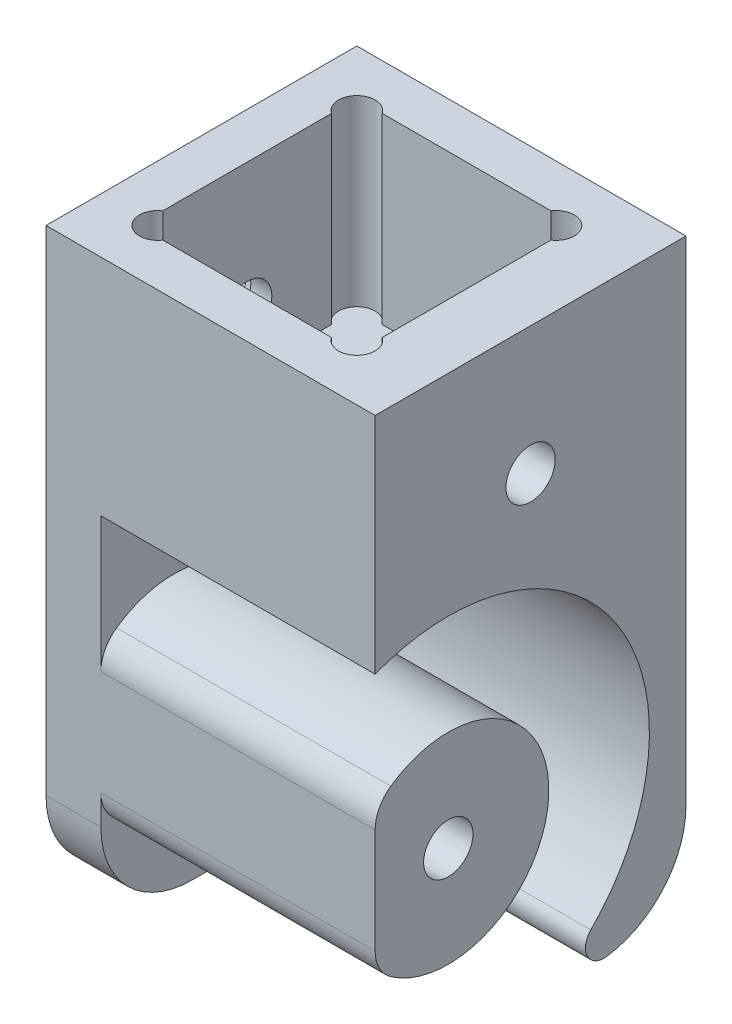
ISO-10303-21;
HEADER;
FILE_DESCRIPTION(('STEP AP214'),'2;1');
FILE_NAME('part.step','',(''),(''),'','','');
FILE_SCHEMA(('AUTOMOTIVE_DESIGN { 1 0 10303 214 1 1 1 1 }'));
ENDSEC;
DATA;
#1=APPLICATION_CONTEXT('core data for automotive mechanical design processes');
#2=APPLICATION_PROTOCOL_DEFINITION('international standard','automotive_design',2000,#1);
#3=PRODUCT_CONTEXT('',#1,'mechanical');
#4=PRODUCT('Part','Part','',(#3));
#5=PRODUCT_RELATED_PRODUCT_CATEGORY('part','',(#4));
#6=PRODUCT_DEFINITION_FORMATION('','',#4);
#7=PRODUCT_DEFINITION_CONTEXT('part definition',#1,'design');
#8=PRODUCT_DEFINITION('design','',#6,#7);
#9=PRODUCT_DEFINITION_SHAPE('','',#8);
#10=(LENGTH_UNIT() NAMED_UNIT(*) SI_UNIT(.MILLI.,.METRE.));
#11=(NAMED_UNIT(*) PLANE_ANGLE_UNIT() SI_UNIT($,.RADIAN.));
#12=(NAMED_UNIT(*) SI_UNIT($,.STERADIAN.) SOLID_ANGLE_UNIT());
#13=UNCERTAINTY_MEASURE_WITH_UNIT(LENGTH_MEASURE(1.E-05),#10,'distance_accuracy_value','');
#14=(GEOMETRIC_REPRESENTATION_CONTEXT(3) GLOBAL_UNCERTAINTY_ASSIGNED_CONTEXT((#13)) GLOBAL_UNIT_ASSIGNED_CONTEXT((#10,
#11,#12)) REPRESENTATION_CONTEXT('',''));
#15=CARTESIAN_POINT('',(0.,0.,0.));
#16=DIRECTION('',(0.,0.,1.));
#17=DIRECTION('',(1.,0.,0.));
#18=AXIS2_PLACEMENT_3D('',#15,#16,#17);
#19=CARTESIAN_POINT('',(-6.,10.,8.5));
#20=DIRECTION('',(1.,0.,0.));
#21=DIRECTION('',(0.,0.,-1.));
#22=AXIS2_PLACEMENT_3D('',#19,#20,#21);
#23=PLANE('',#22);
#24=DIRECTION('',(0.,-1.,0.));
#25=VECTOR('',#24,1.);
#26=CARTESIAN_POINT('',(-6.,10.,8.5));
#27=LINE('',#26,#25);
#28=CARTESIAN_POINT('',(-6.,-15.372281323269,8.5));
#29=VERTEX_POINT('',#28);
#30=CARTESIAN_POINT('',(-6.,-17.,8.5));
#31=VERTEX_POINT('',#30);
#32=EDGE_CURVE('E338',#29,#31,#27,.T.);
#33=ORIENTED_EDGE('',*,*,#32,.T.);
#34=CARTESIAN_POINT('',(-6.,-17.,3.5));
#35=DIRECTION('',(1.,0.,0.));
#36=DIRECTION('',(0.,0.,-1.));
#37=AXIS2_PLACEMENT_3D('',#34,#35,#36);
#38=CIRCLE('',#37,5.);
#39=CARTESIAN_POINT('',(-6.,-22.,3.5));
#40=VERTEX_POINT('',#39);
#41=EDGE_CURVE('E273',#31,#40,#38,.T.);
#42=ORIENTED_EDGE('',*,*,#41,.T.);
#43=DIRECTION('',(0.,0.,1.));
#44=VECTOR('',#43,1.);
#45=CARTESIAN_POINT('',(-6.,-22.,0.));
#46=LINE('',#45,#44);
#47=CARTESIAN_POINT('',(-6.,-22.,-3.5));
#48=VERTEX_POINT('',#47);
#49=EDGE_CURVE('E253',#48,#40,#46,.T.);
#50=ORIENTED_EDGE('',*,*,#49,.F.);
#51=CARTESIAN_POINT('',(-6.,-17.,-3.5));
#52=DIRECTION('',(1.,0.,0.));
#53=DIRECTION('',(0.,0.,-1.));
#54=AXIS2_PLACEMENT_3D('',#51,#52,#53);
#55=CIRCLE('',#54,5.);
#56=CARTESIAN_POINT('',(-6.,-21.960440112722,-4.1277211865939));
#57=VERTEX_POINT('',#56);
#58=EDGE_CURVE('E294',#57,#48,#55,.F.);
#59=ORIENTED_EDGE('',*,*,#58,.F.);
#60=CARTESIAN_POINT('',(-6.,-20.9683520901776,-4.00217694927512));
#61=DIRECTION('',(1.,0.,0.));
#62=DIRECTION('',(0.,0.,-1.));
#63=AXIS2_PLACEMENT_3D('',#60,#61,#62);
#64=CIRCLE('',#63,1.);
#65=CARTESIAN_POINT('',(-6.,-20.2626560826628,-3.29366220350219));
#66=VERTEX_POINT('',#65);
#67=EDGE_CURVE('E12',#57,#66,#64,.F.);
#68=ORIENTED_EDGE('',*,*,#67,.T.);
#69=CARTESIAN_POINT('',(-6.,-12.5,4.5));
#70=DIRECTION('',(1.,0.,0.));
#71=DIRECTION('',(0.,0.,-1.));
#72=AXIS2_PLACEMENT_3D('',#69,#70,#71);
#73=CIRCLE('',#72,11.);
#74=CARTESIAN_POINT('',(-6.,-2.2530492340404,8.5));
#75=VERTEX_POINT('',#74);
#76=EDGE_CURVE('E341',#66,#75,#73,.T.);
#77=ORIENTED_EDGE('',*,*,#76,.T.);
#78=CARTESIAN_POINT('',(-6.,-9.62771867673099,8.5));
#79=VERTEX_POINT('',#78);
#80=EDGE_CURVE('E337',#75,#79,#27,.T.);
#81=ORIENTED_EDGE('',*,*,#80,.T.);
#82=CARTESIAN_POINT('',(-6.,-9.62771867673099,6.5));
#83=DIRECTION('',(1.,0.,0.));
#84=DIRECTION('',(0.,0.,-1.));
#85=AXIS2_PLACEMENT_3D('',#82,#83,#84);
#86=CIRCLE('',#85,2.);
#87=CARTESIAN_POINT('',(-6.,-7.98641506343441,7.64285714285714));
#88=VERTEX_POINT('',#87);
#89=EDGE_CURVE('E289',#79,#88,#86,.F.);
#90=ORIENTED_EDGE('',*,*,#89,.T.);
#91=CARTESIAN_POINT('',(-6.,-12.5,4.5));
#92=DIRECTION('',(1.,0.,0.));
#93=DIRECTION('',(0.,0.,-1.));
#94=AXIS2_PLACEMENT_3D('',#91,#92,#93);
#95=CIRCLE('',#94,5.5);
#96=CARTESIAN_POINT('',(-6.,-17.0135849365656,7.64285714285714));
#97=VERTEX_POINT('',#96);
#98=EDGE_CURVE('E348',#97,#88,#95,.T.);
#99=ORIENTED_EDGE('',*,*,#98,.F.);
#100=CARTESIAN_POINT('',(-6.,-15.372281323269,6.5));
#101=DIRECTION('',(1.,0.,0.));
#102=DIRECTION('',(0.,0.,-1.));
#103=AXIS2_PLACEMENT_3D('',#100,#101,#102);
#104=CIRCLE('',#103,2.);
#105=EDGE_CURVE('E291',#97,#29,#104,.F.);
#106=ORIENTED_EDGE('',*,*,#105,.T.);
#107=EDGE_LOOP('',(#33,#42,#50,#59,#68,#77,#81,#90,#99,#106));
#108=FACE_BOUND('',#107,.T.);
#109=ADVANCED_FACE('F40',(#108),#23,.T.);
#110=CARTESIAN_POINT('',(-9.,10.,8.5));
#111=DIRECTION('',(0.,0.,-1.));
#112=DIRECTION('',(-1.,0.,0.));
#113=AXIS2_PLACEMENT_3D('',#110,#111,#112);
#114=PLANE('',#113);
#115=DIRECTION('',(0.,1.,0.));
#116=VECTOR('',#115,1.);
#117=CARTESIAN_POINT('',(9.,0.,8.5));
#118=LINE('',#117,#116);
#119=CARTESIAN_POINT('',(9.,-15.372281323269,8.5));
#120=VERTEX_POINT('',#119);
#121=CARTESIAN_POINT('',(9.,-9.62771867673099,8.5));
#122=VERTEX_POINT('',#121);
#123=EDGE_CURVE('E344',#120,#122,#118,.T.);
#124=ORIENTED_EDGE('',*,*,#123,.T.);
#125=DIRECTION('',(-1.,0.,0.));
#126=VECTOR('',#125,1.);
#127=CARTESIAN_POINT('',(-9.,-9.62771867673099,8.5));
#128=LINE('',#127,#126);
#129=EDGE_CURVE('E277',#122,#79,#128,.T.);
#130=ORIENTED_EDGE('',*,*,#129,.T.);
#131=ORIENTED_EDGE('',*,*,#80,.F.);
#132=DIRECTION('',(1.,0.,0.));
#133=VECTOR('',#132,1.);
#134=CARTESIAN_POINT('',(-40.1126983722081,-2.25304923404041,8.5));
#135=LINE('',#134,#133);
#136=CARTESIAN_POINT('',(9.,-2.2530492340404,8.5));
#137=VERTEX_POINT('',#136);
#138=EDGE_CURVE('E320',#137,#75,#135,.F.);
#139=ORIENTED_EDGE('',*,*,#138,.F.);
#140=DIRECTION('',(0.,-1.,0.));
#141=VECTOR('',#140,1.);
#142=CARTESIAN_POINT('',(9.,10.,8.5));
#143=LINE('',#142,#141);
#144=CARTESIAN_POINT('',(9.,10.,8.5));
#145=VERTEX_POINT('',#144);
#146=EDGE_CURVE('E241',#145,#137,#143,.T.);
#147=ORIENTED_EDGE('',*,*,#146,.F.);
#148=DIRECTION('',(1.,0.,0.));
#149=VECTOR('',#148,1.);
#150=CARTESIAN_POINT('',(-9.,10.,8.5));
#151=LINE('',#150,#149);
#152=CARTESIAN_POINT('',(-9.,10.,8.5));
#153=VERTEX_POINT('',#152);
#154=EDGE_CURVE('E239',#153,#145,#151,.T.);
#155=ORIENTED_EDGE('',*,*,#154,.F.);
#156=DIRECTION('',(0.,-1.,0.));
#157=VECTOR('',#156,1.);
#158=CARTESIAN_POINT('',(-9.,10.,8.5));
#159=LINE('',#158,#157);
#160=CARTESIAN_POINT('',(-9.,-17.,8.5));
#161=VERTEX_POINT('',#160);
#162=EDGE_CURVE('E244',#153,#161,#159,.T.);
#163=ORIENTED_EDGE('',*,*,#162,.T.);
#164=DIRECTION('',(-1.,0.,0.));
#165=VECTOR('',#164,1.);
#166=CARTESIAN_POINT('',(-6.,-17.,8.5));
#167=LINE('',#166,#165);
#168=EDGE_CURVE('E271',#161,#31,#167,.F.);
#169=ORIENTED_EDGE('',*,*,#168,.T.);
#170=ORIENTED_EDGE('',*,*,#32,.F.);
#171=DIRECTION('',(-1.,0.,0.));
#172=VECTOR('',#171,1.);
#173=CARTESIAN_POINT('',(-9.,-15.372281323269,8.5));
#174=LINE('',#173,#172);
#175=EDGE_CURVE('E275',#29,#120,#174,.F.);
#176=ORIENTED_EDGE('',*,*,#175,.T.);
#177=EDGE_LOOP('',(#124,#130,#131,#139,#147,#155,#163,#169,#170,#176));
#178=FACE_BOUND('',#177,.T.);
#179=ADVANCED_FACE('F334',(#178),#114,.F.);
#180=CARTESIAN_POINT('',(0.,-22.,0.));
#181=DIRECTION('',(0.,-1.,0.));
#182=DIRECTION('',(0.,0.,-1.));
#183=AXIS2_PLACEMENT_3D('',#180,#181,#182);
#184=PLANE('',#183);
#185=DIRECTION('',(1.,0.,0.));
#186=VECTOR('',#185,1.);
#187=CARTESIAN_POINT('',(9.,-22.,-3.5));
#188=LINE('',#187,#186);
#189=CARTESIAN_POINT('',(-9.,-22.,-3.5));
#190=VERTEX_POINT('',#189);
#191=EDGE_CURVE('E256',#190,#48,#188,.T.);
#192=ORIENTED_EDGE('',*,*,#191,.T.);
#193=ORIENTED_EDGE('',*,*,#49,.T.);
#194=DIRECTION('',(-1.,0.,0.));
#195=VECTOR('',#194,1.);
#196=CARTESIAN_POINT('',(-9.,-22.,3.5));
#197=LINE('',#196,#195);
#198=CARTESIAN_POINT('',(-9.,-22.,3.5));
#199=VERTEX_POINT('',#198);
#200=EDGE_CURVE('E266',#40,#199,#197,.T.);
#201=ORIENTED_EDGE('',*,*,#200,.T.);
#202=DIRECTION('',(0.,0.,-1.));
#203=VECTOR('',#202,1.);
#204=CARTESIAN_POINT('',(-9.,-22.,8.5));
#205=LINE('',#204,#203);
#206=EDGE_CURVE('E217',#199,#190,#205,.T.);
#207=ORIENTED_EDGE('',*,*,#206,.T.);
#208=EDGE_LOOP('',(#192,#193,#201,#207));
#209=FACE_BOUND('',#208,.T.);
#210=ADVANCED_FACE('F316',(#209),#184,.T.);
#211=CARTESIAN_POINT('',(0.,10.,0.));
#212=DIRECTION('',(0.,-1.,0.));
#213=DIRECTION('',(0.,0.,-1.));
#214=AXIS2_PLACEMENT_3D('',#211,#212,#213);
#215=PLANE('',#214);
#216=DIRECTION('',(0.,0.,-1.));
#217=VECTOR('',#216,1.);
#218=CARTESIAN_POINT('',(9.,10.,8.5));
#219=LINE('',#218,#217);
#220=CARTESIAN_POINT('',(9.,10.,-8.5));
#221=VERTEX_POINT('',#220);
#222=EDGE_CURVE('E225',#145,#221,#219,.T.);
#223=ORIENTED_EDGE('',*,*,#222,.T.);
#224=DIRECTION('',(-1.,0.,0.));
#225=VECTOR('',#224,1.);
#226=CARTESIAN_POINT('',(-9.,10.,-8.5));
#227=LINE('',#226,#225);
#228=CARTESIAN_POINT('',(-9.,10.,-8.5));
#229=VERTEX_POINT('',#228);
#230=EDGE_CURVE('E235',#221,#229,#227,.T.);
#231=ORIENTED_EDGE('',*,*,#230,.T.);
#232=DIRECTION('',(0.,0.,1.));
#233=VECTOR('',#232,1.);
#234=CARTESIAN_POINT('',(-9.,10.,8.5));
#235=LINE('',#234,#233);
#236=EDGE_CURVE('E237',#229,#153,#235,.T.);
#237=ORIENTED_EDGE('',*,*,#236,.T.);
#238=ORIENTED_EDGE('',*,*,#154,.T.);
#239=EDGE_LOOP('',(#223,#231,#237,#238));
#240=FACE_BOUND('',#239,.T.);
#241=DIRECTION('',(1.,0.,0.));
#242=VECTOR('',#241,1.);
#243=CARTESIAN_POINT('',(-6.5,10.,6.));
#244=LINE('',#243,#242);
#245=CARTESIAN_POINT('',(-5.11305726959826,10.,6.));
#246=VERTEX_POINT('',#245);
#247=CARTESIAN_POINT('',(4.11305726959826,10.,6.));
#248=VERTEX_POINT('',#247);
#249=EDGE_CURVE('E200',#246,#248,#244,.T.);
#250=ORIENTED_EDGE('',*,*,#249,.F.);
#251=CARTESIAN_POINT('',(-5.94472221513642,10.,5.44472221513642));
#252=DIRECTION('',(0.,1.,0.));
#253=DIRECTION('',(0.,0.,-1.));
#254=AXIS2_PLACEMENT_3D('',#251,#252,#253);
#255=CIRCLE('',#254,1.);
#256=CARTESIAN_POINT('',(-6.5,10.,4.61305726959826));
#257=VERTEX_POINT('',#256);
#258=EDGE_CURVE('E371',#257,#246,#255,.T.);
#259=ORIENTED_EDGE('',*,*,#258,.F.);
#260=DIRECTION('',(0.,0.,1.));
#261=VECTOR('',#260,1.);
#262=CARTESIAN_POINT('',(-6.5,10.,6.));
#263=LINE('',#262,#261);
#264=CARTESIAN_POINT('',(-6.5,10.,-4.61305726959826));
#265=VERTEX_POINT('',#264);
#266=EDGE_CURVE('E222',#265,#257,#263,.T.);
#267=ORIENTED_EDGE('',*,*,#266,.F.);
#268=CARTESIAN_POINT('',(-5.94472221513642,10.,-5.44472221513642));
#269=DIRECTION('',(0.,1.,0.));
#270=DIRECTION('',(0.,0.,1.));
#271=AXIS2_PLACEMENT_3D('',#268,#269,#270);
#272=CIRCLE('',#271,1.);
#273=CARTESIAN_POINT('',(-5.11305726959826,10.,-6.));
#274=VERTEX_POINT('',#273);
#275=EDGE_CURVE('E370',#274,#265,#272,.T.);
#276=ORIENTED_EDGE('',*,*,#275,.F.);
#277=DIRECTION('',(-1.,0.,0.));
#278=VECTOR('',#277,1.);
#279=CARTESIAN_POINT('',(-6.5,10.,-6.));
#280=LINE('',#279,#278);
#281=CARTESIAN_POINT('',(4.11305726959825,10.,-6.));
#282=VERTEX_POINT('',#281);
#283=EDGE_CURVE('E211',#282,#274,#280,.T.);
#284=ORIENTED_EDGE('',*,*,#283,.F.);
#285=CARTESIAN_POINT('',(4.94472221513641,10.,-5.44472221513642));
#286=DIRECTION('',(0.,1.,0.));
#287=DIRECTION('',(0.,0.,-1.));
#288=AXIS2_PLACEMENT_3D('',#285,#286,#287);
#289=CIRCLE('',#288,0.999999999999999);
#290=CARTESIAN_POINT('',(5.5,10.,-4.61305726959826));
#291=VERTEX_POINT('',#290);
#292=EDGE_CURVE('E377',#291,#282,#289,.T.);
#293=ORIENTED_EDGE('',*,*,#292,.F.);
#294=DIRECTION('',(0.,0.,-1.));
#295=VECTOR('',#294,1.);
#296=CARTESIAN_POINT('',(5.5,10.,6.));
#297=LINE('',#296,#295);
#298=CARTESIAN_POINT('',(5.5,10.,4.61305726959826));
#299=VERTEX_POINT('',#298);
#300=EDGE_CURVE('E203',#299,#291,#297,.T.);
#301=ORIENTED_EDGE('',*,*,#300,.F.);
#302=CARTESIAN_POINT('',(4.94472221513641,10.,5.44472221513642));
#303=DIRECTION('',(0.,1.,0.));
#304=DIRECTION('',(0.,0.,1.));
#305=AXIS2_PLACEMENT_3D('',#302,#303,#304);
#306=CIRCLE('',#305,0.999999999999999);
#307=EDGE_CURVE('E184',#248,#299,#306,.T.);
#308=ORIENTED_EDGE('',*,*,#307,.F.);
#309=EDGE_LOOP('',(#250,#259,#267,#276,#284,#293,#301,#308));
#310=FACE_BOUND('',#309,.T.);
#311=ADVANCED_FACE('F198',(#240,#310),#215,.F.);
#312=CARTESIAN_POINT('',(9.,10.,8.5));
#313=DIRECTION('',(-1.,0.,0.));
#314=DIRECTION('',(0.,0.,1.));
#315=AXIS2_PLACEMENT_3D('',#312,#313,#314);
#316=PLANE('',#315);
#317=CARTESIAN_POINT('',(9.,3.,0.));
#318=DIRECTION('',(-1.,0.,0.));
#319=DIRECTION('',(0.,0.,1.));
#320=AXIS2_PLACEMENT_3D('',#317,#318,#319);
#321=CIRCLE('',#320,1.35);
#322=CARTESIAN_POINT('',(9.,3.,1.35));
#323=VERTEX_POINT('',#322);
#324=EDGE_CURVE('E384',#323,#323,#321,.T.);
#325=ORIENTED_EDGE('',*,*,#324,.T.);
#326=EDGE_LOOP('',(#325));
#327=FACE_BOUND('',#326,.T.);
#328=CARTESIAN_POINT('',(9.,-12.5,4.5));
#329=DIRECTION('',(-1.,0.,0.));
#330=DIRECTION('',(0.,0.,1.));
#331=AXIS2_PLACEMENT_3D('',#328,#329,#330);
#332=CIRCLE('',#331,11.);
#333=CARTESIAN_POINT('',(9.,-20.2626560826628,-3.29366220350219));
#334=VERTEX_POINT('',#333);
#335=EDGE_CURVE('E306',#137,#334,#332,.T.);
#336=ORIENTED_EDGE('',*,*,#335,.T.);
#337=CARTESIAN_POINT('',(9.,-20.9683520901776,-4.00217694927512));
#338=DIRECTION('',(-1.,0.,0.));
#339=DIRECTION('',(0.,0.,1.));
#340=AXIS2_PLACEMENT_3D('',#337,#338,#339);
#341=CIRCLE('',#340,1.);
#342=CARTESIAN_POINT('',(9.,-21.960440112722,-4.1277211865939));
#343=VERTEX_POINT('',#342);
#344=EDGE_CURVE('E49',#334,#343,#341,.F.);
#345=ORIENTED_EDGE('',*,*,#344,.T.);
#346=CARTESIAN_POINT('',(9.,-17.,-3.5));
#347=DIRECTION('',(-1.,0.,0.));
#348=DIRECTION('',(0.,0.,1.));
#349=AXIS2_PLACEMENT_3D('',#346,#347,#348);
#350=CIRCLE('',#349,5.);
#351=CARTESIAN_POINT('',(9.,-17.,-8.5));
#352=VERTEX_POINT('',#351);
#353=EDGE_CURVE('E259',#343,#352,#350,.F.);
#354=ORIENTED_EDGE('',*,*,#353,.T.);
#355=DIRECTION('',(0.,-1.,0.));
#356=VECTOR('',#355,1.);
#357=CARTESIAN_POINT('',(9.,10.,-8.5));
#358=LINE('',#357,#356);
#359=EDGE_CURVE('E250',#221,#352,#358,.T.);
#360=ORIENTED_EDGE('',*,*,#359,.F.);
#361=ORIENTED_EDGE('',*,*,#222,.F.);
#362=ORIENTED_EDGE('',*,*,#146,.T.);
#363=EDGE_LOOP('',(#336,#345,#354,#360,#361,#362));
#364=FACE_BOUND('',#363,.T.);
#365=ADVANCED_FACE('F304',(#327,#364),#316,.F.);
#366=CARTESIAN_POINT('',(-9.,10.,-8.5));
#367=DIRECTION('',(0.,0.,1.));
#368=DIRECTION('',(1.,0.,0.));
#369=AXIS2_PLACEMENT_3D('',#366,#367,#368);
#370=PLANE('',#369);
#371=ORIENTED_EDGE('',*,*,#359,.T.);
#372=DIRECTION('',(1.,0.,0.));
#373=VECTOR('',#372,1.);
#374=CARTESIAN_POINT('',(-9.,-17.,-8.5));
#375=LINE('',#374,#373);
#376=CARTESIAN_POINT('',(-9.,-17.,-8.5));
#377=VERTEX_POINT('',#376);
#378=EDGE_CURVE('E261',#352,#377,#375,.F.);
#379=ORIENTED_EDGE('',*,*,#378,.T.);
#380=DIRECTION('',(0.,-1.,0.));
#381=VECTOR('',#380,1.);
#382=CARTESIAN_POINT('',(-9.,10.,-8.5));
#383=LINE('',#382,#381);
#384=EDGE_CURVE('E247',#229,#377,#383,.T.);
#385=ORIENTED_EDGE('',*,*,#384,.F.);
#386=ORIENTED_EDGE('',*,*,#230,.F.);
#387=EDGE_LOOP('',(#371,#379,#385,#386));
#388=FACE_BOUND('',#387,.T.);
#389=ADVANCED_FACE('F326',(#388),#370,.F.);
#390=CARTESIAN_POINT('',(-9.,10.,8.5));
#391=DIRECTION('',(1.,0.,0.));
#392=DIRECTION('',(0.,0.,-1.));
#393=AXIS2_PLACEMENT_3D('',#390,#391,#392);
#394=PLANE('',#393);
#395=CARTESIAN_POINT('',(-9.,-12.5,4.5));
#396=DIRECTION('',(-1.,0.,0.));
#397=DIRECTION('',(0.,0.,1.));
#398=AXIS2_PLACEMENT_3D('',#395,#396,#397);
#399=CIRCLE('',#398,2.7);
#400=CARTESIAN_POINT('',(-9.,-12.5,7.2));
#401=VERTEX_POINT('',#400);
#402=EDGE_CURVE('E396',#401,#401,#399,.T.);
#403=ORIENTED_EDGE('',*,*,#402,.F.);
#404=EDGE_LOOP('',(#403));
#405=FACE_BOUND('',#404,.T.);
#406=CARTESIAN_POINT('',(-9.,3.,0.));
#407=DIRECTION('',(-1.,0.,0.));
#408=DIRECTION('',(0.,0.,1.));
#409=AXIS2_PLACEMENT_3D('',#406,#407,#408);
#410=CIRCLE('',#409,2.7);
#411=CARTESIAN_POINT('',(-9.,3.,2.7));
#412=VERTEX_POINT('',#411);
#413=EDGE_CURVE('E390',#412,#412,#410,.T.);
#414=ORIENTED_EDGE('',*,*,#413,.F.);
#415=EDGE_LOOP('',(#414));
#416=FACE_BOUND('',#415,.T.);
#417=ORIENTED_EDGE('',*,*,#206,.F.);
#418=CARTESIAN_POINT('',(-9.,-17.,3.5));
#419=DIRECTION('',(1.,0.,0.));
#420=DIRECTION('',(0.,0.,-1.));
#421=AXIS2_PLACEMENT_3D('',#418,#419,#420);
#422=CIRCLE('',#421,5.);
#423=EDGE_CURVE('E269',#199,#161,#422,.F.);
#424=ORIENTED_EDGE('',*,*,#423,.T.);
#425=ORIENTED_EDGE('',*,*,#162,.F.);
#426=ORIENTED_EDGE('',*,*,#236,.F.);
#427=ORIENTED_EDGE('',*,*,#384,.T.);
#428=CARTESIAN_POINT('',(-9.,-17.,-3.5));
#429=DIRECTION('',(1.,0.,0.));
#430=DIRECTION('',(0.,0.,-1.));
#431=AXIS2_PLACEMENT_3D('',#428,#429,#430);
#432=CIRCLE('',#431,5.);
#433=EDGE_CURVE('E263',#377,#190,#432,.F.);
#434=ORIENTED_EDGE('',*,*,#433,.T.);
#435=EDGE_LOOP('',(#417,#424,#425,#426,#427,#434));
#436=FACE_BOUND('',#435,.T.);
#437=ADVANCED_FACE('F321',(#405,#416,#436),#394,.F.);
#438=CARTESIAN_POINT('',(-6.5,10.,6.));
#439=DIRECTION('',(0.,0.,-1.));
#440=DIRECTION('',(-1.,0.,0.));
#441=AXIS2_PLACEMENT_3D('',#438,#439,#440);
#442=PLANE('',#441);
#443=DIRECTION('',(0.,1.,0.));
#444=VECTOR('',#443,1.);
#445=CARTESIAN_POINT('',(-5.11305726959826,-2.82842712474619,6.));
#446=LINE('',#445,#444);
#447=CARTESIAN_POINT('',(-5.11305726959826,0.,6.));
#448=VERTEX_POINT('',#447);
#449=EDGE_CURVE('E208',#246,#448,#446,.F.);
#450=ORIENTED_EDGE('',*,*,#449,.F.);
#451=ORIENTED_EDGE('',*,*,#249,.T.);
#452=DIRECTION('',(0.,1.,0.));
#453=VECTOR('',#452,1.);
#454=CARTESIAN_POINT('',(4.11305726959826,-2.82842712474619,6.));
#455=LINE('',#454,#453);
#456=CARTESIAN_POINT('',(4.11305726959826,0.,6.));
#457=VERTEX_POINT('',#456);
#458=EDGE_CURVE('E181',#457,#248,#455,.T.);
#459=ORIENTED_EDGE('',*,*,#458,.F.);
#460=DIRECTION('',(1.,0.,0.));
#461=VECTOR('',#460,1.);
#462=CARTESIAN_POINT('',(-6.5,0.,6.));
#463=LINE('',#462,#461);
#464=EDGE_CURVE('E226',#448,#457,#463,.T.);
#465=ORIENTED_EDGE('',*,*,#464,.F.);
#466=EDGE_LOOP('',(#450,#451,#459,#465));
#467=FACE_BOUND('',#466,.T.);
#468=ADVANCED_FACE('F207',(#467),#442,.T.);
#469=CARTESIAN_POINT('',(5.5,10.,6.));
#470=DIRECTION('',(-1.,0.,0.));
#471=DIRECTION('',(0.,0.,1.));
#472=AXIS2_PLACEMENT_3D('',#469,#470,#471);
#473=PLANE('',#472);
#474=CARTESIAN_POINT('',(5.5,3.,0.));
#475=DIRECTION('',(-1.,0.,0.));
#476=DIRECTION('',(0.,0.,1.));
#477=AXIS2_PLACEMENT_3D('',#474,#475,#476);
#478=CIRCLE('',#477,1.35);
#479=CARTESIAN_POINT('',(5.5,3.,1.35));
#480=VERTEX_POINT('',#479);
#481=EDGE_CURVE('E44',#480,#480,#478,.T.);
#482=ORIENTED_EDGE('',*,*,#481,.F.);
#483=EDGE_LOOP('',(#482));
#484=FACE_BOUND('',#483,.T.);
#485=DIRECTION('',(0.,1.,0.));
#486=VECTOR('',#485,1.);
#487=CARTESIAN_POINT('',(5.5,-2.82842712474619,-4.61305726959826));
#488=LINE('',#487,#486);
#489=CARTESIAN_POINT('',(5.5,0.,-4.61305726959826));
#490=VERTEX_POINT('',#489);
#491=EDGE_CURVE('E362',#490,#291,#488,.T.);
#492=ORIENTED_EDGE('',*,*,#491,.F.);
#493=DIRECTION('',(0.,0.,-1.));
#494=VECTOR('',#493,1.);
#495=CARTESIAN_POINT('',(5.5,0.,6.));
#496=LINE('',#495,#494);
#497=CARTESIAN_POINT('',(5.5,0.,4.61305726959826));
#498=VERTEX_POINT('',#497);
#499=EDGE_CURVE('E228',#498,#490,#496,.T.);
#500=ORIENTED_EDGE('',*,*,#499,.F.);
#501=DIRECTION('',(0.,1.,0.));
#502=VECTOR('',#501,1.);
#503=CARTESIAN_POINT('',(5.5,-2.82842712474619,4.61305726959826));
#504=LINE('',#503,#502);
#505=EDGE_CURVE('E193',#299,#498,#504,.F.);
#506=ORIENTED_EDGE('',*,*,#505,.F.);
#507=ORIENTED_EDGE('',*,*,#300,.T.);
#508=EDGE_LOOP('',(#492,#500,#506,#507));
#509=FACE_BOUND('',#508,.T.);
#510=ADVANCED_FACE('F448',(#484,#509),#473,.T.);
#511=CARTESIAN_POINT('',(-6.5,10.,-6.));
#512=DIRECTION('',(0.,0.,1.));
#513=DIRECTION('',(1.,0.,0.));
#514=AXIS2_PLACEMENT_3D('',#511,#512,#513);
#515=PLANE('',#514);
#516=DIRECTION('',(0.,1.,0.));
#517=VECTOR('',#516,1.);
#518=CARTESIAN_POINT('',(-5.11305726959826,-2.82842712474619,-6.));
#519=LINE('',#518,#517);
#520=CARTESIAN_POINT('',(-5.11305726959826,0.,-6.));
#521=VERTEX_POINT('',#520);
#522=EDGE_CURVE('E358',#521,#274,#519,.T.);
#523=ORIENTED_EDGE('',*,*,#522,.F.);
#524=DIRECTION('',(-1.,0.,0.));
#525=VECTOR('',#524,1.);
#526=CARTESIAN_POINT('',(-6.5,0.,-6.));
#527=LINE('',#526,#525);
#528=CARTESIAN_POINT('',(4.11305726959825,0.,-6.));
#529=VERTEX_POINT('',#528);
#530=EDGE_CURVE('E214',#529,#521,#527,.T.);
#531=ORIENTED_EDGE('',*,*,#530,.F.);
#532=DIRECTION('',(0.,1.,0.));
#533=VECTOR('',#532,1.);
#534=CARTESIAN_POINT('',(4.11305726959825,-2.82842712474619,-6.));
#535=LINE('',#534,#533);
#536=EDGE_CURVE('E192',#282,#529,#535,.F.);
#537=ORIENTED_EDGE('',*,*,#536,.F.);
#538=ORIENTED_EDGE('',*,*,#283,.T.);
#539=EDGE_LOOP('',(#523,#531,#537,#538));
#540=FACE_BOUND('',#539,.T.);
#541=ADVANCED_FACE('F444',(#540),#515,.T.);
#542=CARTESIAN_POINT('',(-6.5,10.,6.));
#543=DIRECTION('',(1.,0.,0.));
#544=DIRECTION('',(0.,0.,-1.));
#545=AXIS2_PLACEMENT_3D('',#542,#543,#544);
#546=PLANE('',#545);
#547=CARTESIAN_POINT('',(-6.5,3.,0.));
#548=DIRECTION('',(1.,0.,0.));
#549=DIRECTION('',(0.,0.,-1.));
#550=AXIS2_PLACEMENT_3D('',#547,#548,#549);
#551=CIRCLE('',#550,1.35);
#552=CARTESIAN_POINT('',(-6.5,3.,-1.35));
#553=VERTEX_POINT('',#552);
#554=EDGE_CURVE('E373',#553,#553,#551,.T.);
#555=ORIENTED_EDGE('',*,*,#554,.F.);
#556=EDGE_LOOP('',(#555));
#557=FACE_BOUND('',#556,.T.);
#558=DIRECTION('',(0.,1.,0.));
#559=VECTOR('',#558,1.);
#560=CARTESIAN_POINT('',(-6.5,-2.82842712474619,4.61305726959826));
#561=LINE('',#560,#559);
#562=CARTESIAN_POINT('',(-6.5,0.,4.61305726959826));
#563=VERTEX_POINT('',#562);
#564=EDGE_CURVE('E356',#563,#257,#561,.T.);
#565=ORIENTED_EDGE('',*,*,#564,.F.);
#566=DIRECTION('',(0.,0.,1.));
#567=VECTOR('',#566,1.);
#568=CARTESIAN_POINT('',(-6.5,0.,6.));
#569=LINE('',#568,#567);
#570=CARTESIAN_POINT('',(-6.5,0.,-4.61305726959826));
#571=VERTEX_POINT('',#570);
#572=EDGE_CURVE('E209',#571,#563,#569,.T.);
#573=ORIENTED_EDGE('',*,*,#572,.F.);
#574=DIRECTION('',(0.,1.,0.));
#575=VECTOR('',#574,1.);
#576=CARTESIAN_POINT('',(-6.5,-2.82842712474619,-4.61305726959826));
#577=LINE('',#576,#575);
#578=EDGE_CURVE('E360',#265,#571,#577,.F.);
#579=ORIENTED_EDGE('',*,*,#578,.F.);
#580=ORIENTED_EDGE('',*,*,#266,.T.);
#581=EDGE_LOOP('',(#565,#573,#579,#580));
#582=FACE_BOUND('',#581,.T.);
#583=ADVANCED_FACE('F440',(#557,#582),#546,.T.);
#584=CARTESIAN_POINT('',(0.,0.,0.));
#585=DIRECTION('',(0.,-1.,0.));
#586=DIRECTION('',(0.,0.,-1.));
#587=AXIS2_PLACEMENT_3D('',#584,#585,#586);
#588=PLANE('',#587);
#589=CARTESIAN_POINT('',(-5.94472221513642,0.,5.44472221513642));
#590=DIRECTION('',(0.,-1.,0.));
#591=DIRECTION('',(0.,0.,-1.));
#592=AXIS2_PLACEMENT_3D('',#589,#590,#591);
#593=CIRCLE('',#592,1.);
#594=EDGE_CURVE('E367',#563,#448,#593,.F.);
#595=ORIENTED_EDGE('',*,*,#594,.T.);
#596=ORIENTED_EDGE('',*,*,#464,.T.);
#597=CARTESIAN_POINT('',(4.94472221513641,0.,5.44472221513642));
#598=DIRECTION('',(0.,-1.,0.));
#599=DIRECTION('',(0.,0.,-1.));
#600=AXIS2_PLACEMENT_3D('',#597,#598,#599);
#601=CIRCLE('',#600,0.999999999999999);
#602=EDGE_CURVE('E187',#457,#498,#601,.F.);
#603=ORIENTED_EDGE('',*,*,#602,.T.);
#604=ORIENTED_EDGE('',*,*,#499,.T.);
#605=CARTESIAN_POINT('',(4.94472221513641,0.,-5.44472221513642));
#606=DIRECTION('',(0.,-1.,0.));
#607=DIRECTION('',(0.,0.,-1.));
#608=AXIS2_PLACEMENT_3D('',#605,#606,#607);
#609=CIRCLE('',#608,0.999999999999999);
#610=EDGE_CURVE('E204',#490,#529,#609,.F.);
#611=ORIENTED_EDGE('',*,*,#610,.T.);
#612=ORIENTED_EDGE('',*,*,#530,.T.);
#613=CARTESIAN_POINT('',(-5.94472221513642,0.,-5.44472221513642));
#614=DIRECTION('',(0.,-1.,0.));
#615=DIRECTION('',(0.,0.,-1.));
#616=AXIS2_PLACEMENT_3D('',#613,#614,#615);
#617=CIRCLE('',#616,1.);
#618=EDGE_CURVE('E374',#521,#571,#617,.F.);
#619=ORIENTED_EDGE('',*,*,#618,.T.);
#620=ORIENTED_EDGE('',*,*,#572,.T.);
#621=EDGE_LOOP('',(#595,#596,#603,#604,#611,#612,#619,#620));
#622=FACE_BOUND('',#621,.T.);
#623=ADVANCED_FACE('F435',(#622),#588,.F.);
#624=CARTESIAN_POINT('',(-40.1126983722081,-12.5,4.5));
#625=DIRECTION('',(1.,0.,0.));
#626=DIRECTION('',(0.,0.,-1.));
#627=AXIS2_PLACEMENT_3D('',#624,#625,#626);
#628=CYLINDRICAL_SURFACE('',#627,11.);
#629=ORIENTED_EDGE('',*,*,#76,.F.);
#630=DIRECTION('',(1.,0.,0.));
#631=VECTOR('',#630,1.);
#632=CARTESIAN_POINT('',(-40.1126983722081,-20.2626560826628,-3.29366220350219));
#633=LINE('',#632,#631);
#634=EDGE_CURVE('E56',#66,#334,#633,.T.);
#635=ORIENTED_EDGE('',*,*,#634,.T.);
#636=ORIENTED_EDGE('',*,*,#335,.F.);
#637=ORIENTED_EDGE('',*,*,#138,.T.);
#638=EDGE_LOOP('',(#629,#635,#636,#637));
#639=FACE_BOUND('',#638,.T.);
#640=ADVANCED_FACE('F432',(#639),#628,.F.);
#641=CARTESIAN_POINT('',(23.5344418537486,-12.5,4.5));
#642=DIRECTION('',(-1.,0.,0.));
#643=DIRECTION('',(0.,0.,1.));
#644=AXIS2_PLACEMENT_3D('',#641,#642,#643);
#645=CYLINDRICAL_SURFACE('',#644,5.5);
#646=ORIENTED_EDGE('',*,*,#98,.T.);
#647=DIRECTION('',(-1.,0.,0.));
#648=VECTOR('',#647,1.);
#649=CARTESIAN_POINT('',(23.5344418537486,-7.98641506343441,7.64285714285714));
#650=LINE('',#649,#648);
#651=CARTESIAN_POINT('',(9.,-7.98641506343441,7.64285714285714));
#652=VERTEX_POINT('',#651);
#653=EDGE_CURVE('E283',#88,#652,#650,.F.);
#654=ORIENTED_EDGE('',*,*,#653,.T.);
#655=CARTESIAN_POINT('',(9.,-12.5,4.5));
#656=DIRECTION('',(-1.,0.,0.));
#657=DIRECTION('',(0.,0.,1.));
#658=AXIS2_PLACEMENT_3D('',#655,#656,#657);
#659=CIRCLE('',#658,5.5);
#660=CARTESIAN_POINT('',(9.,-17.0135849365656,7.64285714285714));
#661=VERTEX_POINT('',#660);
#662=EDGE_CURVE('E345',#652,#661,#659,.T.);
#663=ORIENTED_EDGE('',*,*,#662,.T.);
#664=DIRECTION('',(-1.,0.,0.));
#665=VECTOR('',#664,1.);
#666=CARTESIAN_POINT('',(23.5344418537486,-17.0135849365656,7.64285714285714));
#667=LINE('',#666,#665);
#668=EDGE_CURVE('E280',#661,#97,#667,.T.);
#669=ORIENTED_EDGE('',*,*,#668,.T.);
#670=EDGE_LOOP('',(#646,#654,#663,#669));
#671=FACE_BOUND('',#670,.T.);
#672=ADVANCED_FACE('F430',(#671),#645,.T.);
#673=CARTESIAN_POINT('',(9.,10.,8.5));
#674=DIRECTION('',(-1.,0.,0.));
#675=DIRECTION('',(0.,0.,1.));
#676=AXIS2_PLACEMENT_3D('',#673,#674,#675);
#677=PLANE('',#676);
#678=CARTESIAN_POINT('',(9.,-12.5,4.5));
#679=DIRECTION('',(1.,0.,0.));
#680=DIRECTION('',(0.,0.,-1.));
#681=AXIS2_PLACEMENT_3D('',#678,#679,#680);
#682=CIRCLE('',#681,1.35);
#683=CARTESIAN_POINT('',(9.,-12.5,3.15));
#684=VERTEX_POINT('',#683);
#685=EDGE_CURVE('E351',#684,#684,#682,.T.);
#686=ORIENTED_EDGE('',*,*,#685,.F.);
#687=EDGE_LOOP('',(#686));
#688=FACE_BOUND('',#687,.T.);
#689=ORIENTED_EDGE('',*,*,#662,.F.);
#690=CARTESIAN_POINT('',(9.,-9.62771867673099,6.5));
#691=DIRECTION('',(-1.,0.,0.));
#692=DIRECTION('',(0.,0.,1.));
#693=AXIS2_PLACEMENT_3D('',#690,#691,#692);
#694=CIRCLE('',#693,2.);
#695=EDGE_CURVE('E287',#652,#122,#694,.F.);
#696=ORIENTED_EDGE('',*,*,#695,.T.);
#697=ORIENTED_EDGE('',*,*,#123,.F.);
#698=CARTESIAN_POINT('',(9.,-15.372281323269,6.5));
#699=DIRECTION('',(-1.,0.,0.));
#700=DIRECTION('',(0.,0.,1.));
#701=AXIS2_PLACEMENT_3D('',#698,#699,#700);
#702=CIRCLE('',#701,2.);
#703=EDGE_CURVE('E285',#120,#661,#702,.F.);
#704=ORIENTED_EDGE('',*,*,#703,.T.);
#705=EDGE_LOOP('',(#689,#696,#697,#704));
#706=FACE_BOUND('',#705,.T.);
#707=ADVANCED_FACE('F485',(#688,#706),#677,.F.);
#708=CARTESIAN_POINT('',(-9.,-12.5,4.5));
#709=DIRECTION('',(1.,0.,0.));
#710=DIRECTION('',(0.,0.,-1.));
#711=AXIS2_PLACEMENT_3D('',#708,#709,#710);
#712=CYLINDRICAL_SURFACE('',#711,1.35);
#713=CARTESIAN_POINT('',(-7.65,-12.5,4.5));
#714=DIRECTION('',(-1.,0.,0.));
#715=DIRECTION('',(0.,0.,1.));
#716=AXIS2_PLACEMENT_3D('',#713,#714,#715);
#717=CIRCLE('',#716,1.35);
#718=CARTESIAN_POINT('',(-7.65,-12.5,5.85));
#719=VERTEX_POINT('',#718);
#720=EDGE_CURVE('E393',#719,#719,#717,.T.);
#721=ORIENTED_EDGE('',*,*,#720,.T.);
#722=EDGE_LOOP('',(#721));
#723=FACE_BOUND('',#722,.T.);
#724=ORIENTED_EDGE('',*,*,#685,.T.);
#725=EDGE_LOOP('',(#724));
#726=FACE_BOUND('',#725,.T.);
#727=ADVANCED_FACE('F465',(#723,#726),#712,.F.);
#728=CARTESIAN_POINT('',(0.,-17.,-3.5));
#729=DIRECTION('',(-1.,0.,0.));
#730=DIRECTION('',(0.,0.,1.));
#731=AXIS2_PLACEMENT_3D('',#728,#729,#730);
#732=CYLINDRICAL_SURFACE('',#731,5.);
#733=ORIENTED_EDGE('',*,*,#353,.F.);
#734=DIRECTION('',(-1.,0.,0.));
#735=VECTOR('',#734,1.);
#736=CARTESIAN_POINT('',(0.,-21.960440112722,-4.1277211865939));
#737=LINE('',#736,#735);
#738=EDGE_CURVE('E297',#343,#57,#737,.T.);
#739=ORIENTED_EDGE('',*,*,#738,.T.);
#740=ORIENTED_EDGE('',*,*,#58,.T.);
#741=ORIENTED_EDGE('',*,*,#191,.F.);
#742=ORIENTED_EDGE('',*,*,#433,.F.);
#743=ORIENTED_EDGE('',*,*,#378,.F.);
#744=EDGE_LOOP('',(#733,#739,#740,#741,#742,#743));
#745=FACE_BOUND('',#744,.T.);
#746=ADVANCED_FACE('F311',(#745),#732,.T.);
#747=CARTESIAN_POINT('',(-5.94472221513642,-2.82842712474619,-5.44472221513642));
#748=DIRECTION('',(0.,1.,0.));
#749=DIRECTION('',(0.,0.,1.));
#750=AXIS2_PLACEMENT_3D('',#747,#748,#749);
#751=CYLINDRICAL_SURFACE('',#750,1.);
#752=ORIENTED_EDGE('',*,*,#522,.T.);
#753=ORIENTED_EDGE('',*,*,#275,.T.);
#754=ORIENTED_EDGE('',*,*,#578,.T.);
#755=ORIENTED_EDGE('',*,*,#618,.F.);
#756=EDGE_LOOP('',(#752,#753,#754,#755));
#757=FACE_BOUND('',#756,.T.);
#758=ADVANCED_FACE('F464',(#757),#751,.F.);
#759=CARTESIAN_POINT('',(-5.94472221513642,-2.82842712474619,5.44472221513642));
#760=DIRECTION('',(0.,1.,0.));
#761=DIRECTION('',(0.,0.,1.));
#762=AXIS2_PLACEMENT_3D('',#759,#760,#761);
#763=CYLINDRICAL_SURFACE('',#762,1.);
#764=ORIENTED_EDGE('',*,*,#449,.T.);
#765=ORIENTED_EDGE('',*,*,#594,.F.);
#766=ORIENTED_EDGE('',*,*,#564,.T.);
#767=ORIENTED_EDGE('',*,*,#258,.T.);
#768=EDGE_LOOP('',(#764,#765,#766,#767));
#769=FACE_BOUND('',#768,.T.);
#770=ADVANCED_FACE('F509',(#769),#763,.F.);
#771=CARTESIAN_POINT('',(4.94472221513641,-2.82842712474619,-5.44472221513642));
#772=DIRECTION('',(0.,1.,0.));
#773=DIRECTION('',(0.,0.,1.));
#774=AXIS2_PLACEMENT_3D('',#771,#772,#773);
#775=CYLINDRICAL_SURFACE('',#774,0.999999999999999);
#776=ORIENTED_EDGE('',*,*,#491,.T.);
#777=ORIENTED_EDGE('',*,*,#292,.T.);
#778=ORIENTED_EDGE('',*,*,#536,.T.);
#779=ORIENTED_EDGE('',*,*,#610,.F.);
#780=EDGE_LOOP('',(#776,#777,#778,#779));
#781=FACE_BOUND('',#780,.T.);
#782=ADVANCED_FACE('F508',(#781),#775,.F.);
#783=CARTESIAN_POINT('',(4.94472221513641,-2.82842712474619,5.44472221513642));
#784=DIRECTION('',(0.,1.,0.));
#785=DIRECTION('',(0.,0.,1.));
#786=AXIS2_PLACEMENT_3D('',#783,#784,#785);
#787=CYLINDRICAL_SURFACE('',#786,0.999999999999999);
#788=ORIENTED_EDGE('',*,*,#458,.T.);
#789=ORIENTED_EDGE('',*,*,#307,.T.);
#790=ORIENTED_EDGE('',*,*,#505,.T.);
#791=ORIENTED_EDGE('',*,*,#602,.F.);
#792=EDGE_LOOP('',(#788,#789,#790,#791));
#793=FACE_BOUND('',#792,.T.);
#794=ADVANCED_FACE('F183',(#793),#787,.F.);
#795=CARTESIAN_POINT('',(0.,-17.,3.5));
#796=DIRECTION('',(1.,0.,0.));
#797=DIRECTION('',(0.,0.,-1.));
#798=AXIS2_PLACEMENT_3D('',#795,#796,#797);
#799=CYLINDRICAL_SURFACE('',#798,5.);
#800=ORIENTED_EDGE('',*,*,#41,.F.);
#801=ORIENTED_EDGE('',*,*,#168,.F.);
#802=ORIENTED_EDGE('',*,*,#423,.F.);
#803=ORIENTED_EDGE('',*,*,#200,.F.);
#804=EDGE_LOOP('',(#800,#801,#802,#803));
#805=FACE_BOUND('',#804,.T.);
#806=ADVANCED_FACE('F466',(#805),#799,.T.);
#807=CARTESIAN_POINT('',(23.5344418537486,-9.62771867673099,6.5));
#808=DIRECTION('',(-1.,0.,0.));
#809=DIRECTION('',(0.,0.,1.));
#810=AXIS2_PLACEMENT_3D('',#807,#808,#809);
#811=CYLINDRICAL_SURFACE('',#810,2.);
#812=ORIENTED_EDGE('',*,*,#695,.F.);
#813=ORIENTED_EDGE('',*,*,#653,.F.);
#814=ORIENTED_EDGE('',*,*,#89,.F.);
#815=ORIENTED_EDGE('',*,*,#129,.F.);
#816=EDGE_LOOP('',(#812,#813,#814,#815));
#817=FACE_BOUND('',#816,.T.);
#818=ADVANCED_FACE('F469',(#817),#811,.T.);
#819=CARTESIAN_POINT('',(23.5344418537486,-15.372281323269,6.5));
#820=DIRECTION('',(-1.,0.,0.));
#821=DIRECTION('',(0.,0.,1.));
#822=AXIS2_PLACEMENT_3D('',#819,#820,#821);
#823=CYLINDRICAL_SURFACE('',#822,2.);
#824=ORIENTED_EDGE('',*,*,#703,.F.);
#825=ORIENTED_EDGE('',*,*,#175,.F.);
#826=ORIENTED_EDGE('',*,*,#105,.F.);
#827=ORIENTED_EDGE('',*,*,#668,.F.);
#828=EDGE_LOOP('',(#824,#825,#826,#827));
#829=FACE_BOUND('',#828,.T.);
#830=ADVANCED_FACE('F472',(#829),#823,.T.);
#831=CARTESIAN_POINT('',(-40.1126983722081,-20.9683520901776,-4.00217694927512));
#832=DIRECTION('',(1.,0.,0.));
#833=DIRECTION('',(0.,0.,-1.));
#834=AXIS2_PLACEMENT_3D('',#831,#832,#833);
#835=CYLINDRICAL_SURFACE('',#834,1.);
#836=ORIENTED_EDGE('',*,*,#344,.F.);
#837=ORIENTED_EDGE('',*,*,#634,.F.);
#838=ORIENTED_EDGE('',*,*,#67,.F.);
#839=ORIENTED_EDGE('',*,*,#738,.F.);
#840=EDGE_LOOP('',(#836,#837,#838,#839));
#841=FACE_BOUND('',#840,.T.);
#842=ADVANCED_FACE('F42',(#841),#835,.T.);
#843=CARTESIAN_POINT('',(-9.,3.,0.));
#844=DIRECTION('',(-1.,0.,0.));
#845=DIRECTION('',(0.,0.,1.));
#846=AXIS2_PLACEMENT_3D('',#843,#844,#845);
#847=CYLINDRICAL_SURFACE('',#846,1.35);
#848=ORIENTED_EDGE('',*,*,#481,.T.);
#849=EDGE_LOOP('',(#848));
#850=FACE_BOUND('',#849,.T.);
#851=ORIENTED_EDGE('',*,*,#324,.F.);
#852=EDGE_LOOP('',(#851));
#853=FACE_BOUND('',#852,.T.);
#854=ADVANCED_FACE('F418',(#850,#853),#847,.F.);
#855=ORIENTED_EDGE('',*,*,#554,.T.);
#856=EDGE_LOOP('',(#855));
#857=FACE_BOUND('',#856,.T.);
#858=CARTESIAN_POINT('',(-7.65,3.,0.));
#859=DIRECTION('',(-1.,0.,0.));
#860=DIRECTION('',(0.,0.,1.));
#861=AXIS2_PLACEMENT_3D('',#858,#859,#860);
#862=CIRCLE('',#861,1.35);
#863=CARTESIAN_POINT('',(-7.65,3.,1.35));
#864=VERTEX_POINT('',#863);
#865=EDGE_CURVE('E387',#864,#864,#862,.T.);
#866=ORIENTED_EDGE('',*,*,#865,.T.);
#867=EDGE_LOOP('',(#866));
#868=FACE_BOUND('',#867,.T.);
#869=ADVANCED_FACE('F409',(#857,#868),#847,.F.);
#870=CARTESIAN_POINT('',(-9.,3.,0.));
#871=DIRECTION('',(-1.,0.,0.));
#872=DIRECTION('',(0.,0.,1.));
#873=AXIS2_PLACEMENT_3D('',#870,#871,#872);
#874=CONICAL_SURFACE('',#873,2.7,0.785398163397448);
#875=ORIENTED_EDGE('',*,*,#865,.F.);
#876=EDGE_LOOP('',(#875));
#877=FACE_BOUND('',#876,.T.);
#878=ORIENTED_EDGE('',*,*,#413,.T.);
#879=EDGE_LOOP('',(#878));
#880=FACE_BOUND('',#879,.T.);
#881=ADVANCED_FACE('F407',(#877,#880),#874,.F.);
#882=CARTESIAN_POINT('',(-9.,-12.5,4.5));
#883=DIRECTION('',(-1.,0.,0.));
#884=DIRECTION('',(0.,0.,1.));
#885=AXIS2_PLACEMENT_3D('',#882,#883,#884);
#886=CONICAL_SURFACE('',#885,2.7,0.785398163397449);
#887=ORIENTED_EDGE('',*,*,#720,.F.);
#888=EDGE_LOOP('',(#887));
#889=FACE_BOUND('',#888,.T.);
#890=ORIENTED_EDGE('',*,*,#402,.T.);
#891=EDGE_LOOP('',(#890));
#892=FACE_BOUND('',#891,.T.);
#893=ADVANCED_FACE('F400',(#889,#892),#886,.F.);
#894=CLOSED_SHELL('',(#109,#179,#210,#311,#365,#389,#437,#468,#510,#541,#583,#623,#640,#672,
#707,#727,#746,#758,#770,#782,#794,#806,#818,#830,#842,#854,#869,#881,#893));
#895=MANIFOLD_SOLID_BREP('B2',#894);
#896=ADVANCED_BREP_SHAPE_REPRESENTATION('',(#18,#895),#14);
#897=SHAPE_DEFINITION_REPRESENTATION(#9,#896);
ENDSEC;
END-ISO-10303-21;
